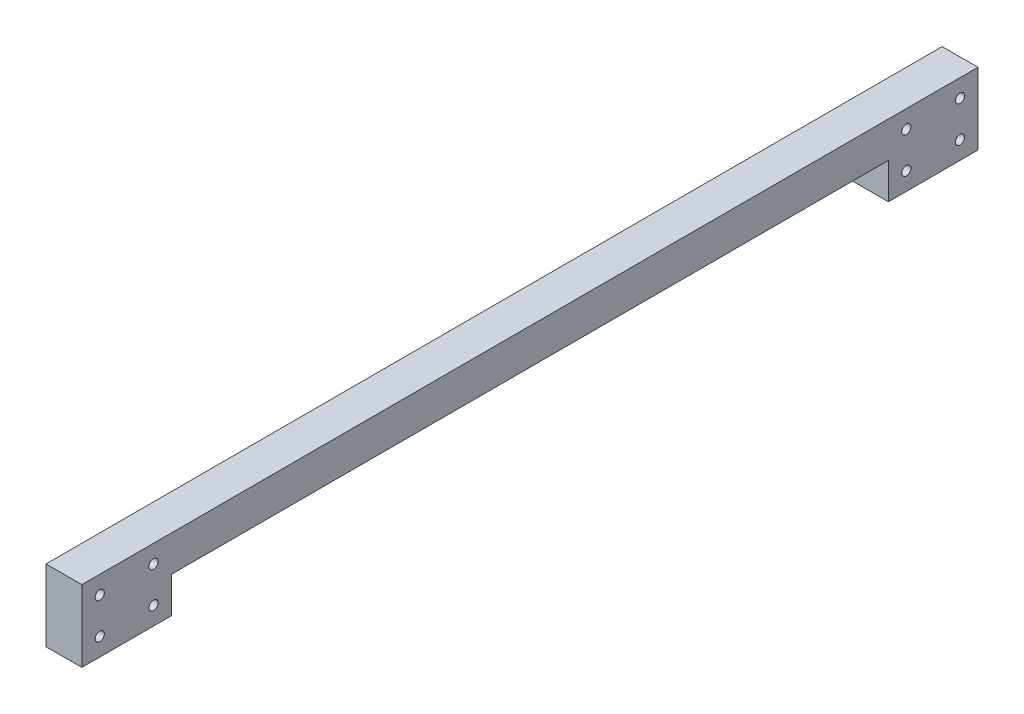
ISO-10303-21;
HEADER;
FILE_DESCRIPTION(('STEP AP214'),'2;1');
FILE_NAME('part.step','',(''),(''),'','','');
FILE_SCHEMA(('AUTOMOTIVE_DESIGN { 1 0 10303 214 1 1 1 1 }'));
ENDSEC;
DATA;
#1=APPLICATION_CONTEXT('core data for automotive mechanical design processes');
#2=APPLICATION_PROTOCOL_DEFINITION('international standard','automotive_design',2000,#1);
#3=PRODUCT_CONTEXT('',#1,'mechanical');
#4=PRODUCT('Part','Part','',(#3));
#5=PRODUCT_RELATED_PRODUCT_CATEGORY('part','',(#4));
#6=PRODUCT_DEFINITION_FORMATION('','',#4);
#7=PRODUCT_DEFINITION_CONTEXT('part definition',#1,'design');
#8=PRODUCT_DEFINITION('design','',#6,#7);
#9=PRODUCT_DEFINITION_SHAPE('','',#8);
#10=(LENGTH_UNIT() NAMED_UNIT(*) SI_UNIT(.MILLI.,.METRE.));
#11=(NAMED_UNIT(*) PLANE_ANGLE_UNIT() SI_UNIT($,.RADIAN.));
#12=(NAMED_UNIT(*) SI_UNIT($,.STERADIAN.) SOLID_ANGLE_UNIT());
#13=UNCERTAINTY_MEASURE_WITH_UNIT(LENGTH_MEASURE(1.E-05),#10,'distance_accuracy_value','');
#14=(GEOMETRIC_REPRESENTATION_CONTEXT(3) GLOBAL_UNCERTAINTY_ASSIGNED_CONTEXT((#13)) GLOBAL_UNIT_ASSIGNED_CONTEXT((#10,
#11,#12)) REPRESENTATION_CONTEXT('',''));
#15=CARTESIAN_POINT('',(0.,0.,0.));
#16=DIRECTION('',(0.,0.,1.));
#17=DIRECTION('',(1.,0.,0.));
#18=AXIS2_PLACEMENT_3D('',#15,#16,#17);
#19=CARTESIAN_POINT('',(-10.,-10.,500.));
#20=DIRECTION('',(0.,1.,0.));
#21=DIRECTION('',(0.,0.,1.));
#22=AXIS2_PLACEMENT_3D('',#19,#20,#21);
#23=PLANE('',#22);
#24=DIRECTION('',(0.,0.,-1.));
#25=VECTOR('',#24,1.);
#26=CARTESIAN_POINT('',(10.,-10.,500.));
#27=LINE('',#26,#25);
#28=CARTESIAN_POINT('',(10.,-10.,450.));
#29=VERTEX_POINT('',#28);
#30=CARTESIAN_POINT('',(10.,-10.,50.));
#31=VERTEX_POINT('',#30);
#32=EDGE_CURVE('E48',#29,#31,#27,.T.);
#33=ORIENTED_EDGE('',*,*,#32,.F.);
#34=DIRECTION('',(-1.,0.,0.));
#35=VECTOR('',#34,1.);
#36=CARTESIAN_POINT('',(-10.,-10.,450.));
#37=LINE('',#36,#35);
#38=CARTESIAN_POINT('',(-10.,-10.,450.));
#39=VERTEX_POINT('',#38);
#40=EDGE_CURVE('E119',#29,#39,#37,.T.);
#41=ORIENTED_EDGE('',*,*,#40,.T.);
#42=DIRECTION('',(0.,0.,-1.));
#43=VECTOR('',#42,1.);
#44=CARTESIAN_POINT('',(-10.,-10.,500.));
#45=LINE('',#44,#43);
#46=CARTESIAN_POINT('',(-10.,-10.,50.));
#47=VERTEX_POINT('',#46);
#48=EDGE_CURVE('E103',#39,#47,#45,.T.);
#49=ORIENTED_EDGE('',*,*,#48,.T.);
#50=DIRECTION('',(-1.,0.,0.));
#51=VECTOR('',#50,1.);
#52=CARTESIAN_POINT('',(-10.,-10.,50.));
#53=LINE('',#52,#51);
#54=EDGE_CURVE('E148',#31,#47,#53,.T.);
#55=ORIENTED_EDGE('',*,*,#54,.F.);
#56=EDGE_LOOP('',(#33,#41,#49,#55));
#57=FACE_BOUND('',#56,.T.);
#58=ADVANCED_FACE('F33',(#57),#23,.F.);
#59=CARTESIAN_POINT('',(10.,10.,500.));
#60=DIRECTION('',(-1.,0.,0.));
#61=DIRECTION('',(0.,0.,1.));
#62=AXIS2_PLACEMENT_3D('',#59,#60,#61);
#63=PLANE('',#62);
#64=CARTESIAN_POINT('',(10.,0.,40.));
#65=DIRECTION('',(1.,0.,0.));
#66=DIRECTION('',(0.,0.,-1.));
#67=AXIS2_PLACEMENT_3D('',#64,#65,#66);
#68=CIRCLE('',#67,2.55);
#69=CARTESIAN_POINT('',(10.,0.,37.45));
#70=VERTEX_POINT('',#69);
#71=EDGE_CURVE('E198',#70,#70,#68,.T.);
#72=ORIENTED_EDGE('',*,*,#71,.F.);
#73=EDGE_LOOP('',(#72));
#74=FACE_BOUND('',#73,.T.);
#75=CARTESIAN_POINT('',(10.,0.,10.));
#76=DIRECTION('',(1.,0.,0.));
#77=DIRECTION('',(0.,0.,-1.));
#78=AXIS2_PLACEMENT_3D('',#75,#76,#77);
#79=CIRCLE('',#78,2.55);
#80=CARTESIAN_POINT('',(10.,0.,7.45));
#81=VERTEX_POINT('',#80);
#82=EDGE_CURVE('E202',#81,#81,#79,.T.);
#83=ORIENTED_EDGE('',*,*,#82,.F.);
#84=EDGE_LOOP('',(#83));
#85=FACE_BOUND('',#84,.T.);
#86=CARTESIAN_POINT('',(10.,-20.,490.));
#87=DIRECTION('',(1.,0.,0.));
#88=DIRECTION('',(0.,0.,-1.));
#89=AXIS2_PLACEMENT_3D('',#86,#87,#88);
#90=CIRCLE('',#89,2.54999999999999);
#91=CARTESIAN_POINT('',(10.,-20.,487.45));
#92=VERTEX_POINT('',#91);
#93=EDGE_CURVE('E206',#92,#92,#90,.T.);
#94=ORIENTED_EDGE('',*,*,#93,.F.);
#95=EDGE_LOOP('',(#94));
#96=FACE_BOUND('',#95,.T.);
#97=CARTESIAN_POINT('',(10.,-20.,460.));
#98=DIRECTION('',(1.,0.,0.));
#99=DIRECTION('',(0.,0.,-1.));
#100=AXIS2_PLACEMENT_3D('',#97,#98,#99);
#101=CIRCLE('',#100,2.54999999999999);
#102=CARTESIAN_POINT('',(10.,-20.,457.45));
#103=VERTEX_POINT('',#102);
#104=EDGE_CURVE('E210',#103,#103,#101,.T.);
#105=ORIENTED_EDGE('',*,*,#104,.F.);
#106=EDGE_LOOP('',(#105));
#107=FACE_BOUND('',#106,.T.);
#108=CARTESIAN_POINT('',(10.,0.,460.));
#109=DIRECTION('',(1.,0.,0.));
#110=DIRECTION('',(0.,0.,-1.));
#111=AXIS2_PLACEMENT_3D('',#108,#109,#110);
#112=CIRCLE('',#111,2.54999999999999);
#113=CARTESIAN_POINT('',(10.,0.,457.45));
#114=VERTEX_POINT('',#113);
#115=EDGE_CURVE('E214',#114,#114,#112,.T.);
#116=ORIENTED_EDGE('',*,*,#115,.F.);
#117=EDGE_LOOP('',(#116));
#118=FACE_BOUND('',#117,.T.);
#119=CARTESIAN_POINT('',(10.,0.,490.));
#120=DIRECTION('',(1.,0.,0.));
#121=DIRECTION('',(0.,0.,-1.));
#122=AXIS2_PLACEMENT_3D('',#119,#120,#121);
#123=CIRCLE('',#122,2.54999999999999);
#124=CARTESIAN_POINT('',(10.,0.,487.45));
#125=VERTEX_POINT('',#124);
#126=EDGE_CURVE('E218',#125,#125,#123,.T.);
#127=ORIENTED_EDGE('',*,*,#126,.F.);
#128=EDGE_LOOP('',(#127));
#129=FACE_BOUND('',#128,.T.);
#130=CARTESIAN_POINT('',(10.,-20.,10.));
#131=DIRECTION('',(1.,0.,0.));
#132=DIRECTION('',(0.,0.,-1.));
#133=AXIS2_PLACEMENT_3D('',#130,#131,#132);
#134=CIRCLE('',#133,2.55);
#135=CARTESIAN_POINT('',(10.,-20.,7.45));
#136=VERTEX_POINT('',#135);
#137=EDGE_CURVE('E138',#136,#136,#134,.T.);
#138=ORIENTED_EDGE('',*,*,#137,.F.);
#139=EDGE_LOOP('',(#138));
#140=FACE_BOUND('',#139,.T.);
#141=CARTESIAN_POINT('',(10.,-20.,40.));
#142=DIRECTION('',(1.,0.,0.));
#143=DIRECTION('',(0.,0.,-1.));
#144=AXIS2_PLACEMENT_3D('',#141,#142,#143);
#145=CIRCLE('',#144,2.55);
#146=CARTESIAN_POINT('',(10.,-20.,37.45));
#147=VERTEX_POINT('',#146);
#148=EDGE_CURVE('E142',#147,#147,#145,.T.);
#149=ORIENTED_EDGE('',*,*,#148,.F.);
#150=EDGE_LOOP('',(#149));
#151=FACE_BOUND('',#150,.T.);
#152=DIRECTION('',(0.,1.,0.));
#153=VECTOR('',#152,1.);
#154=CARTESIAN_POINT('',(10.,10.,0.));
#155=LINE('',#154,#153);
#156=CARTESIAN_POINT('',(10.,-30.,0.));
#157=VERTEX_POINT('',#156);
#158=CARTESIAN_POINT('',(10.,10.,0.));
#159=VERTEX_POINT('',#158);
#160=EDGE_CURVE('E168',#157,#159,#155,.T.);
#161=ORIENTED_EDGE('',*,*,#160,.T.);
#162=DIRECTION('',(0.,0.,-1.));
#163=VECTOR('',#162,1.);
#164=CARTESIAN_POINT('',(10.,10.,500.));
#165=LINE('',#164,#163);
#166=CARTESIAN_POINT('',(10.,10.,500.));
#167=VERTEX_POINT('',#166);
#168=EDGE_CURVE('E11',#167,#159,#165,.T.);
#169=ORIENTED_EDGE('',*,*,#168,.F.);
#170=DIRECTION('',(0.,1.,0.));
#171=VECTOR('',#170,1.);
#172=CARTESIAN_POINT('',(10.,10.,500.));
#173=LINE('',#172,#171);
#174=CARTESIAN_POINT('',(10.,-30.,500.));
#175=VERTEX_POINT('',#174);
#176=EDGE_CURVE('E108',#175,#167,#173,.T.);
#177=ORIENTED_EDGE('',*,*,#176,.F.);
#178=DIRECTION('',(0.,0.,-1.));
#179=VECTOR('',#178,1.);
#180=CARTESIAN_POINT('',(10.,-30.,500.));
#181=LINE('',#180,#179);
#182=CARTESIAN_POINT('',(10.,-30.,450.));
#183=VERTEX_POINT('',#182);
#184=EDGE_CURVE('E122',#175,#183,#181,.T.);
#185=ORIENTED_EDGE('',*,*,#184,.T.);
#186=DIRECTION('',(0.,1.,0.));
#187=VECTOR('',#186,1.);
#188=CARTESIAN_POINT('',(10.,-30.,450.));
#189=LINE('',#188,#187);
#190=EDGE_CURVE('E109',#183,#29,#189,.T.);
#191=ORIENTED_EDGE('',*,*,#190,.T.);
#192=ORIENTED_EDGE('',*,*,#32,.T.);
#193=DIRECTION('',(0.,1.,0.));
#194=VECTOR('',#193,1.);
#195=CARTESIAN_POINT('',(10.,-30.,50.));
#196=LINE('',#195,#194);
#197=CARTESIAN_POINT('',(10.,-30.,50.));
#198=VERTEX_POINT('',#197);
#199=EDGE_CURVE('E165',#198,#31,#196,.T.);
#200=ORIENTED_EDGE('',*,*,#199,.F.);
#201=DIRECTION('',(0.,0.,1.));
#202=VECTOR('',#201,1.);
#203=CARTESIAN_POINT('',(10.,-30.,0.));
#204=LINE('',#203,#202);
#205=EDGE_CURVE('E157',#157,#198,#204,.T.);
#206=ORIENTED_EDGE('',*,*,#205,.F.);
#207=EDGE_LOOP('',(#161,#169,#177,#185,#191,#192,#200,#206));
#208=FACE_BOUND('',#207,.T.);
#209=ADVANCED_FACE('F35',(#74,#85,#96,#107,#118,#129,#140,#151,#208),#63,.F.);
#210=CARTESIAN_POINT('',(-10.,10.,500.));
#211=DIRECTION('',(0.,-1.,0.));
#212=DIRECTION('',(0.,0.,-1.));
#213=AXIS2_PLACEMENT_3D('',#210,#211,#212);
#214=PLANE('',#213);
#215=DIRECTION('',(0.,0.,-1.));
#216=VECTOR('',#215,1.);
#217=CARTESIAN_POINT('',(-10.,10.,500.));
#218=LINE('',#217,#216);
#219=CARTESIAN_POINT('',(-10.,10.,500.));
#220=VERTEX_POINT('',#219);
#221=CARTESIAN_POINT('',(-10.,10.,0.));
#222=VERTEX_POINT('',#221);
#223=EDGE_CURVE('E41',#220,#222,#218,.T.);
#224=ORIENTED_EDGE('',*,*,#223,.F.);
#225=DIRECTION('',(-1.,0.,0.));
#226=VECTOR('',#225,1.);
#227=CARTESIAN_POINT('',(-10.,10.,500.));
#228=LINE('',#227,#226);
#229=EDGE_CURVE('E135',#167,#220,#228,.T.);
#230=ORIENTED_EDGE('',*,*,#229,.F.);
#231=ORIENTED_EDGE('',*,*,#168,.T.);
#232=DIRECTION('',(-1.,0.,0.));
#233=VECTOR('',#232,1.);
#234=CARTESIAN_POINT('',(-10.,10.,0.));
#235=LINE('',#234,#233);
#236=EDGE_CURVE('E170',#159,#222,#235,.T.);
#237=ORIENTED_EDGE('',*,*,#236,.T.);
#238=EDGE_LOOP('',(#224,#230,#231,#237));
#239=FACE_BOUND('',#238,.T.);
#240=ADVANCED_FACE('F187',(#239),#214,.F.);
#241=CARTESIAN_POINT('',(-10.,10.,500.));
#242=DIRECTION('',(1.,0.,0.));
#243=DIRECTION('',(0.,1.,0.));
#244=AXIS2_PLACEMENT_3D('',#241,#242,#243);
#245=PLANE('',#244);
#246=CARTESIAN_POINT('',(-10.,0.,40.));
#247=DIRECTION('',(1.,0.,0.));
#248=DIRECTION('',(0.,1.,0.));
#249=AXIS2_PLACEMENT_3D('',#246,#247,#248);
#250=CIRCLE('',#249,2.55);
#251=CARTESIAN_POINT('',(-10.,2.55,40.));
#252=VERTEX_POINT('',#251);
#253=EDGE_CURVE('E252',#252,#252,#250,.F.);
#254=ORIENTED_EDGE('',*,*,#253,.F.);
#255=EDGE_LOOP('',(#254));
#256=FACE_BOUND('',#255,.T.);
#257=CARTESIAN_POINT('',(-10.,0.,10.));
#258=DIRECTION('',(1.,0.,0.));
#259=DIRECTION('',(0.,1.,0.));
#260=AXIS2_PLACEMENT_3D('',#257,#258,#259);
#261=CIRCLE('',#260,2.55);
#262=CARTESIAN_POINT('',(-10.,2.55,10.));
#263=VERTEX_POINT('',#262);
#264=EDGE_CURVE('E256',#263,#263,#261,.F.);
#265=ORIENTED_EDGE('',*,*,#264,.F.);
#266=EDGE_LOOP('',(#265));
#267=FACE_BOUND('',#266,.T.);
#268=CARTESIAN_POINT('',(-10.,-20.,490.));
#269=DIRECTION('',(1.,0.,0.));
#270=DIRECTION('',(0.,1.,0.));
#271=AXIS2_PLACEMENT_3D('',#268,#269,#270);
#272=CIRCLE('',#271,2.54999999999999);
#273=CARTESIAN_POINT('',(-10.,-17.45,490.));
#274=VERTEX_POINT('',#273);
#275=EDGE_CURVE('E260',#274,#274,#272,.F.);
#276=ORIENTED_EDGE('',*,*,#275,.F.);
#277=EDGE_LOOP('',(#276));
#278=FACE_BOUND('',#277,.T.);
#279=CARTESIAN_POINT('',(-10.,-20.,460.));
#280=DIRECTION('',(1.,0.,0.));
#281=DIRECTION('',(0.,1.,0.));
#282=AXIS2_PLACEMENT_3D('',#279,#280,#281);
#283=CIRCLE('',#282,2.54999999999999);
#284=CARTESIAN_POINT('',(-10.,-17.45,460.));
#285=VERTEX_POINT('',#284);
#286=EDGE_CURVE('E264',#285,#285,#283,.F.);
#287=ORIENTED_EDGE('',*,*,#286,.F.);
#288=EDGE_LOOP('',(#287));
#289=FACE_BOUND('',#288,.T.);
#290=CARTESIAN_POINT('',(-10.,0.,460.));
#291=DIRECTION('',(1.,0.,0.));
#292=DIRECTION('',(0.,1.,0.));
#293=AXIS2_PLACEMENT_3D('',#290,#291,#292);
#294=CIRCLE('',#293,2.54999999999999);
#295=CARTESIAN_POINT('',(-10.,2.54999999999999,460.));
#296=VERTEX_POINT('',#295);
#297=EDGE_CURVE('E268',#296,#296,#294,.F.);
#298=ORIENTED_EDGE('',*,*,#297,.F.);
#299=EDGE_LOOP('',(#298));
#300=FACE_BOUND('',#299,.T.);
#301=CARTESIAN_POINT('',(-10.,0.,490.));
#302=DIRECTION('',(1.,0.,0.));
#303=DIRECTION('',(0.,1.,0.));
#304=AXIS2_PLACEMENT_3D('',#301,#302,#303);
#305=CIRCLE('',#304,2.54999999999999);
#306=CARTESIAN_POINT('',(-10.,2.54999999999999,490.));
#307=VERTEX_POINT('',#306);
#308=EDGE_CURVE('E129',#307,#307,#305,.F.);
#309=ORIENTED_EDGE('',*,*,#308,.F.);
#310=EDGE_LOOP('',(#309));
#311=FACE_BOUND('',#310,.T.);
#312=CARTESIAN_POINT('',(-10.,-20.,10.));
#313=DIRECTION('',(1.,0.,0.));
#314=DIRECTION('',(0.,0.,-1.));
#315=AXIS2_PLACEMENT_3D('',#312,#313,#314);
#316=CIRCLE('',#315,2.55);
#317=CARTESIAN_POINT('',(-10.,-20.,7.45));
#318=VERTEX_POINT('',#317);
#319=EDGE_CURVE('E139',#318,#318,#316,.T.);
#320=ORIENTED_EDGE('',*,*,#319,.T.);
#321=EDGE_LOOP('',(#320));
#322=FACE_BOUND('',#321,.T.);
#323=CARTESIAN_POINT('',(-10.,-20.,40.));
#324=DIRECTION('',(1.,0.,0.));
#325=DIRECTION('',(0.,0.,-1.));
#326=AXIS2_PLACEMENT_3D('',#323,#324,#325);
#327=CIRCLE('',#326,2.55);
#328=CARTESIAN_POINT('',(-10.,-20.,37.45));
#329=VERTEX_POINT('',#328);
#330=EDGE_CURVE('E145',#329,#329,#327,.T.);
#331=ORIENTED_EDGE('',*,*,#330,.T.);
#332=EDGE_LOOP('',(#331));
#333=FACE_BOUND('',#332,.T.);
#334=DIRECTION('',(0.,1.,0.));
#335=VECTOR('',#334,1.);
#336=CARTESIAN_POINT('',(-10.,-30.,50.));
#337=LINE('',#336,#335);
#338=CARTESIAN_POINT('',(-10.,-30.,50.));
#339=VERTEX_POINT('',#338);
#340=EDGE_CURVE('E161',#339,#47,#337,.T.);
#341=ORIENTED_EDGE('',*,*,#340,.T.);
#342=ORIENTED_EDGE('',*,*,#48,.F.);
#343=DIRECTION('',(0.,1.,0.));
#344=VECTOR('',#343,1.);
#345=CARTESIAN_POINT('',(-10.,-30.,450.));
#346=LINE('',#345,#344);
#347=CARTESIAN_POINT('',(-10.,-30.,450.));
#348=VERTEX_POINT('',#347);
#349=EDGE_CURVE('E97',#348,#39,#346,.T.);
#350=ORIENTED_EDGE('',*,*,#349,.F.);
#351=DIRECTION('',(0.,0.,1.));
#352=VECTOR('',#351,1.);
#353=CARTESIAN_POINT('',(-10.,-30.,500.));
#354=LINE('',#353,#352);
#355=CARTESIAN_POINT('',(-10.,-30.,500.));
#356=VERTEX_POINT('',#355);
#357=EDGE_CURVE('E101',#348,#356,#354,.T.);
#358=ORIENTED_EDGE('',*,*,#357,.T.);
#359=DIRECTION('',(0.,-1.,0.));
#360=VECTOR('',#359,1.);
#361=CARTESIAN_POINT('',(-10.,10.,500.));
#362=LINE('',#361,#360);
#363=EDGE_CURVE('E133',#220,#356,#362,.T.);
#364=ORIENTED_EDGE('',*,*,#363,.F.);
#365=ORIENTED_EDGE('',*,*,#223,.T.);
#366=DIRECTION('',(0.,-1.,0.));
#367=VECTOR('',#366,1.);
#368=CARTESIAN_POINT('',(-10.,10.,0.));
#369=LINE('',#368,#367);
#370=CARTESIAN_POINT('',(-10.,-30.,0.));
#371=VERTEX_POINT('',#370);
#372=EDGE_CURVE('E172',#222,#371,#369,.T.);
#373=ORIENTED_EDGE('',*,*,#372,.T.);
#374=DIRECTION('',(0.,0.,-1.));
#375=VECTOR('',#374,1.);
#376=CARTESIAN_POINT('',(-10.,-30.,0.));
#377=LINE('',#376,#375);
#378=EDGE_CURVE('E151',#339,#371,#377,.T.);
#379=ORIENTED_EDGE('',*,*,#378,.F.);
#380=EDGE_LOOP('',(#341,#342,#350,#358,#364,#365,#373,#379));
#381=FACE_BOUND('',#380,.T.);
#382=ADVANCED_FACE('F100',(#256,#267,#278,#289,#300,#311,#322,#333,#381),#245,.F.);
#383=CARTESIAN_POINT('',(0.,0.,0.));
#384=DIRECTION('',(0.,0.,1.));
#385=DIRECTION('',(1.,0.,0.));
#386=AXIS2_PLACEMENT_3D('',#383,#384,#385);
#387=PLANE('',#386);
#388=DIRECTION('',(1.,0.,0.));
#389=VECTOR('',#388,1.);
#390=CARTESIAN_POINT('',(-10.,-30.,0.));
#391=LINE('',#390,#389);
#392=EDGE_CURVE('E154',#371,#157,#391,.T.);
#393=ORIENTED_EDGE('',*,*,#392,.F.);
#394=ORIENTED_EDGE('',*,*,#372,.F.);
#395=ORIENTED_EDGE('',*,*,#236,.F.);
#396=ORIENTED_EDGE('',*,*,#160,.F.);
#397=EDGE_LOOP('',(#393,#394,#395,#396));
#398=FACE_BOUND('',#397,.T.);
#399=ADVANCED_FACE('F241',(#398),#387,.F.);
#400=CARTESIAN_POINT('',(-10.,-30.,50.));
#401=DIRECTION('',(0.,0.,-1.));
#402=DIRECTION('',(-1.,0.,0.));
#403=AXIS2_PLACEMENT_3D('',#400,#401,#402);
#404=PLANE('',#403);
#405=ORIENTED_EDGE('',*,*,#54,.T.);
#406=ORIENTED_EDGE('',*,*,#340,.F.);
#407=DIRECTION('',(-1.,0.,0.));
#408=VECTOR('',#407,1.);
#409=CARTESIAN_POINT('',(-10.,-30.,50.));
#410=LINE('',#409,#408);
#411=EDGE_CURVE('E159',#198,#339,#410,.T.);
#412=ORIENTED_EDGE('',*,*,#411,.F.);
#413=ORIENTED_EDGE('',*,*,#199,.T.);
#414=EDGE_LOOP('',(#405,#406,#412,#413));
#415=FACE_BOUND('',#414,.T.);
#416=ADVANCED_FACE('F178',(#415),#404,.F.);
#417=CARTESIAN_POINT('',(0.,-30.,0.));
#418=DIRECTION('',(0.,1.,0.));
#419=DIRECTION('',(0.,0.,1.));
#420=AXIS2_PLACEMENT_3D('',#417,#418,#419);
#421=PLANE('',#420);
#422=ORIENTED_EDGE('',*,*,#378,.T.);
#423=ORIENTED_EDGE('',*,*,#392,.T.);
#424=ORIENTED_EDGE('',*,*,#205,.T.);
#425=ORIENTED_EDGE('',*,*,#411,.T.);
#426=EDGE_LOOP('',(#422,#423,#424,#425));
#427=FACE_BOUND('',#426,.T.);
#428=ADVANCED_FACE('F184',(#427),#421,.F.);
#429=CARTESIAN_POINT('',(-10.,-20.,40.));
#430=DIRECTION('',(1.,0.,0.));
#431=DIRECTION('',(0.,0.,-1.));
#432=AXIS2_PLACEMENT_3D('',#429,#430,#431);
#433=CYLINDRICAL_SURFACE('',#432,2.55);
#434=ORIENTED_EDGE('',*,*,#330,.F.);
#435=EDGE_LOOP('',(#434));
#436=FACE_BOUND('',#435,.T.);
#437=ORIENTED_EDGE('',*,*,#148,.T.);
#438=EDGE_LOOP('',(#437));
#439=FACE_BOUND('',#438,.T.);
#440=ADVANCED_FACE('F223',(#436,#439),#433,.F.);
#441=CARTESIAN_POINT('',(-10.,-20.,10.));
#442=DIRECTION('',(1.,0.,0.));
#443=DIRECTION('',(0.,0.,-1.));
#444=AXIS2_PLACEMENT_3D('',#441,#442,#443);
#445=CYLINDRICAL_SURFACE('',#444,2.55);
#446=ORIENTED_EDGE('',*,*,#319,.F.);
#447=EDGE_LOOP('',(#446));
#448=FACE_BOUND('',#447,.T.);
#449=ORIENTED_EDGE('',*,*,#137,.T.);
#450=EDGE_LOOP('',(#449));
#451=FACE_BOUND('',#450,.T.);
#452=ADVANCED_FACE('F225',(#448,#451),#445,.F.);
#453=CARTESIAN_POINT('',(0.,0.,500.));
#454=DIRECTION('',(0.,0.,-1.));
#455=DIRECTION('',(1.,0.,0.));
#456=AXIS2_PLACEMENT_3D('',#453,#454,#455);
#457=PLANE('',#456);
#458=ORIENTED_EDGE('',*,*,#176,.T.);
#459=ORIENTED_EDGE('',*,*,#229,.T.);
#460=ORIENTED_EDGE('',*,*,#363,.T.);
#461=DIRECTION('',(1.,0.,0.));
#462=VECTOR('',#461,1.);
#463=CARTESIAN_POINT('',(-10.,-30.,500.));
#464=LINE('',#463,#462);
#465=EDGE_CURVE('E118',#356,#175,#464,.T.);
#466=ORIENTED_EDGE('',*,*,#465,.T.);
#467=EDGE_LOOP('',(#458,#459,#460,#466));
#468=FACE_BOUND('',#467,.T.);
#469=ADVANCED_FACE('F232',(#468),#457,.F.);
#470=CARTESIAN_POINT('',(-10.,-30.,450.));
#471=DIRECTION('',(0.,0.,-1.));
#472=DIRECTION('',(-1.,0.,0.));
#473=AXIS2_PLACEMENT_3D('',#470,#471,#472);
#474=PLANE('',#473);
#475=ORIENTED_EDGE('',*,*,#40,.F.);
#476=ORIENTED_EDGE('',*,*,#190,.F.);
#477=DIRECTION('',(-1.,0.,0.));
#478=VECTOR('',#477,1.);
#479=CARTESIAN_POINT('',(-10.,-30.,450.));
#480=LINE('',#479,#478);
#481=EDGE_CURVE('E115',#183,#348,#480,.T.);
#482=ORIENTED_EDGE('',*,*,#481,.T.);
#483=ORIENTED_EDGE('',*,*,#349,.T.);
#484=EDGE_LOOP('',(#475,#476,#482,#483));
#485=FACE_BOUND('',#484,.T.);
#486=ADVANCED_FACE('F121',(#485),#474,.T.);
#487=CARTESIAN_POINT('',(0.,-30.,500.));
#488=DIRECTION('',(0.,1.,0.));
#489=DIRECTION('',(0.,0.,-1.));
#490=AXIS2_PLACEMENT_3D('',#487,#488,#489);
#491=PLANE('',#490);
#492=ORIENTED_EDGE('',*,*,#357,.F.);
#493=ORIENTED_EDGE('',*,*,#481,.F.);
#494=ORIENTED_EDGE('',*,*,#184,.F.);
#495=ORIENTED_EDGE('',*,*,#465,.F.);
#496=EDGE_LOOP('',(#492,#493,#494,#495));
#497=FACE_BOUND('',#496,.T.);
#498=ADVANCED_FACE('F113',(#497),#491,.F.);
#499=CARTESIAN_POINT('',(-10.001,0.,490.));
#500=DIRECTION('',(1.,0.,0.));
#501=DIRECTION('',(0.,0.,-1.));
#502=AXIS2_PLACEMENT_3D('',#499,#500,#501);
#503=CYLINDRICAL_SURFACE('',#502,2.54999999999999);
#504=ORIENTED_EDGE('',*,*,#126,.T.);
#505=EDGE_LOOP('',(#504));
#506=FACE_BOUND('',#505,.T.);
#507=ORIENTED_EDGE('',*,*,#308,.T.);
#508=EDGE_LOOP('',(#507));
#509=FACE_BOUND('',#508,.T.);
#510=ADVANCED_FACE('F309',(#506,#509),#503,.F.);
#511=CARTESIAN_POINT('',(-10.001,0.,460.));
#512=DIRECTION('',(1.,0.,0.));
#513=DIRECTION('',(0.,0.,-1.));
#514=AXIS2_PLACEMENT_3D('',#511,#512,#513);
#515=CYLINDRICAL_SURFACE('',#514,2.54999999999999);
#516=ORIENTED_EDGE('',*,*,#115,.T.);
#517=EDGE_LOOP('',(#516));
#518=FACE_BOUND('',#517,.T.);
#519=ORIENTED_EDGE('',*,*,#297,.T.);
#520=EDGE_LOOP('',(#519));
#521=FACE_BOUND('',#520,.T.);
#522=ADVANCED_FACE('F301',(#518,#521),#515,.F.);
#523=CARTESIAN_POINT('',(-10.001,-20.,460.));
#524=DIRECTION('',(1.,0.,0.));
#525=DIRECTION('',(0.,0.,-1.));
#526=AXIS2_PLACEMENT_3D('',#523,#524,#525);
#527=CYLINDRICAL_SURFACE('',#526,2.54999999999999);
#528=ORIENTED_EDGE('',*,*,#104,.T.);
#529=EDGE_LOOP('',(#528));
#530=FACE_BOUND('',#529,.T.);
#531=ORIENTED_EDGE('',*,*,#286,.T.);
#532=EDGE_LOOP('',(#531));
#533=FACE_BOUND('',#532,.T.);
#534=ADVANCED_FACE('F292',(#530,#533),#527,.F.);
#535=CARTESIAN_POINT('',(-10.001,-20.,490.));
#536=DIRECTION('',(1.,0.,0.));
#537=DIRECTION('',(0.,0.,-1.));
#538=AXIS2_PLACEMENT_3D('',#535,#536,#537);
#539=CYLINDRICAL_SURFACE('',#538,2.54999999999999);
#540=ORIENTED_EDGE('',*,*,#93,.T.);
#541=EDGE_LOOP('',(#540));
#542=FACE_BOUND('',#541,.T.);
#543=ORIENTED_EDGE('',*,*,#275,.T.);
#544=EDGE_LOOP('',(#543));
#545=FACE_BOUND('',#544,.T.);
#546=ADVANCED_FACE('F288',(#542,#545),#539,.F.);
#547=CARTESIAN_POINT('',(-10.001,0.,10.));
#548=DIRECTION('',(1.,0.,0.));
#549=DIRECTION('',(0.,0.,-1.));
#550=AXIS2_PLACEMENT_3D('',#547,#548,#549);
#551=CYLINDRICAL_SURFACE('',#550,2.55);
#552=ORIENTED_EDGE('',*,*,#82,.T.);
#553=EDGE_LOOP('',(#552));
#554=FACE_BOUND('',#553,.T.);
#555=ORIENTED_EDGE('',*,*,#264,.T.);
#556=EDGE_LOOP('',(#555));
#557=FACE_BOUND('',#556,.T.);
#558=ADVANCED_FACE('F291',(#554,#557),#551,.F.);
#559=CARTESIAN_POINT('',(-10.001,0.,40.));
#560=DIRECTION('',(1.,0.,0.));
#561=DIRECTION('',(0.,0.,-1.));
#562=AXIS2_PLACEMENT_3D('',#559,#560,#561);
#563=CYLINDRICAL_SURFACE('',#562,2.55);
#564=ORIENTED_EDGE('',*,*,#71,.T.);
#565=EDGE_LOOP('',(#564));
#566=FACE_BOUND('',#565,.T.);
#567=ORIENTED_EDGE('',*,*,#253,.T.);
#568=EDGE_LOOP('',(#567));
#569=FACE_BOUND('',#568,.T.);
#570=ADVANCED_FACE('F298',(#566,#569),#563,.F.);
#571=CLOSED_SHELL('',(#58,#209,#240,#382,#399,#416,#428,#440,#452,#469,#486,#498,#510,#522,#534,
#546,#558,#570));
#572=MANIFOLD_SOLID_BREP('B2',#571);
#573=ADVANCED_BREP_SHAPE_REPRESENTATION('',(#18,#572),#14);
#574=SHAPE_DEFINITION_REPRESENTATION(#9,#573);
ENDSEC;
END-ISO-10303-21;
